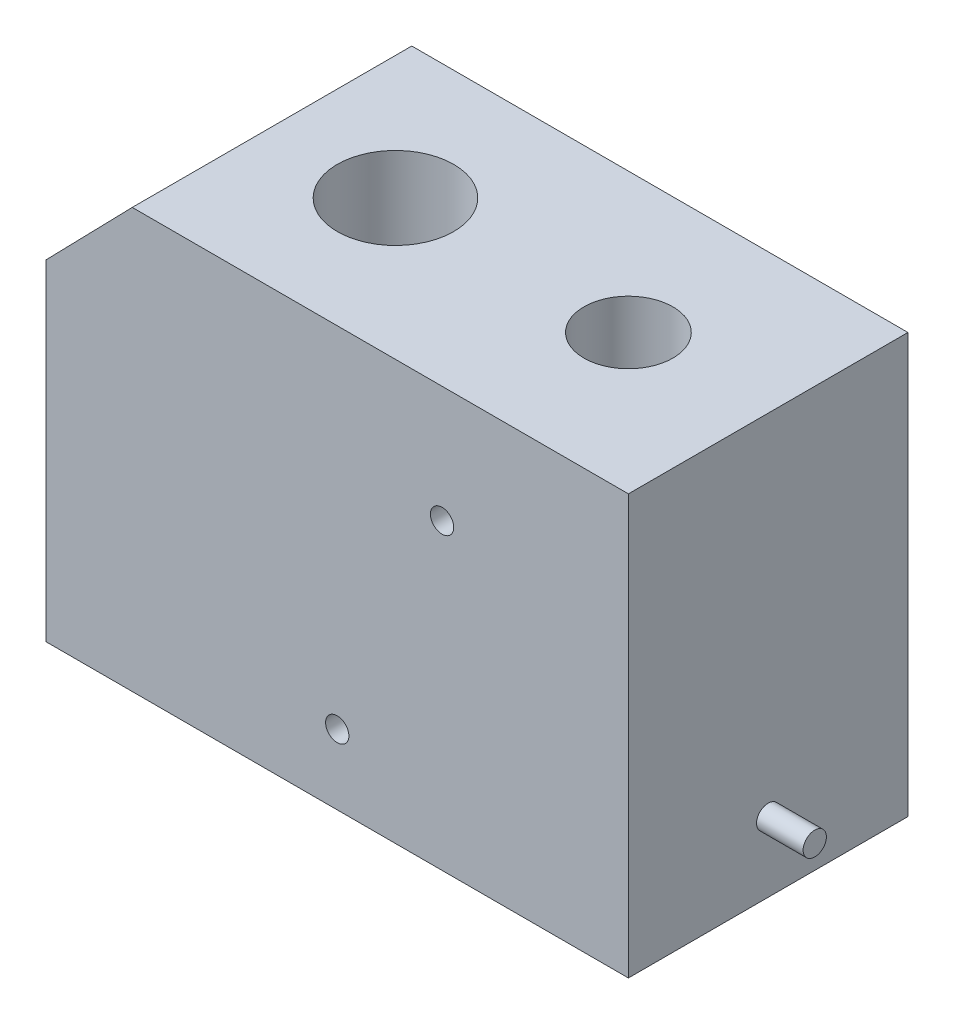
ISO-10303-21;
HEADER;
FILE_DESCRIPTION(('STEP AP214'),'2;1');
FILE_NAME('part.step','',(''),(''),'','','');
FILE_SCHEMA(('AUTOMOTIVE_DESIGN { 1 0 10303 214 1 1 1 1 }'));
ENDSEC;
DATA;
#1=APPLICATION_CONTEXT('core data for automotive mechanical design processes');
#2=APPLICATION_PROTOCOL_DEFINITION('international standard','automotive_design',2000,#1);
#3=PRODUCT_CONTEXT('',#1,'mechanical');
#4=PRODUCT('Part','Part','',(#3));
#5=PRODUCT_RELATED_PRODUCT_CATEGORY('part','',(#4));
#6=PRODUCT_DEFINITION_FORMATION('','',#4);
#7=PRODUCT_DEFINITION_CONTEXT('part definition',#1,'design');
#8=PRODUCT_DEFINITION('design','',#6,#7);
#9=PRODUCT_DEFINITION_SHAPE('','',#8);
#10=(LENGTH_UNIT() NAMED_UNIT(*) SI_UNIT(.MILLI.,.METRE.));
#11=(NAMED_UNIT(*) PLANE_ANGLE_UNIT() SI_UNIT($,.RADIAN.));
#12=(NAMED_UNIT(*) SI_UNIT($,.STERADIAN.) SOLID_ANGLE_UNIT());
#13=UNCERTAINTY_MEASURE_WITH_UNIT(LENGTH_MEASURE(1.E-05),#10,'distance_accuracy_value','');
#14=(GEOMETRIC_REPRESENTATION_CONTEXT(3) GLOBAL_UNCERTAINTY_ASSIGNED_CONTEXT((#13)) GLOBAL_UNIT_ASSIGNED_CONTEXT((#10,
#11,#12)) REPRESENTATION_CONTEXT('',''));
#15=CARTESIAN_POINT('',(0.,0.,0.));
#16=DIRECTION('',(0.,0.,1.));
#17=DIRECTION('',(1.,0.,0.));
#18=AXIS2_PLACEMENT_3D('',#15,#16,#17);
#19=CARTESIAN_POINT('',(0.,0.,0.));
#20=DIRECTION('',(0.,0.,-1.));
#21=DIRECTION('',(-1.,0.,0.));
#22=AXIS2_PLACEMENT_3D('',#19,#20,#21);
#23=PLANE('',#22);
#24=CARTESIAN_POINT('',(55.,-58.,0.));
#25=DIRECTION('',(0.,0.,-1.));
#26=DIRECTION('',(-1.,0.,0.));
#27=AXIS2_PLACEMENT_3D('',#24,#25,#26);
#28=CIRCLE('',#27,5.);
#29=CARTESIAN_POINT('',(50.,-58.,0.));
#30=VERTEX_POINT('',#29);
#31=EDGE_CURVE('E122',#30,#30,#28,.T.);
#32=ORIENTED_EDGE('',*,*,#31,.F.);
#33=EDGE_LOOP('',(#32));
#34=FACE_BOUND('',#33,.T.);
#35=DIRECTION('',(0.,-1.,0.));
#36=VECTOR('',#35,1.);
#37=CARTESIAN_POINT('',(-125.,-90.,0.));
#38=LINE('',#37,#36);
#39=CARTESIAN_POINT('',(-125.,52.,0.));
#40=VERTEX_POINT('',#39);
#41=CARTESIAN_POINT('',(-125.,-90.,0.));
#42=VERTEX_POINT('',#41);
#43=EDGE_CURVE('E163',#40,#42,#38,.T.);
#44=ORIENTED_EDGE('',*,*,#43,.F.);
#45=DIRECTION('',(0.697616683154663,0.716471188104788,0.));
#46=VECTOR('',#45,1.);
#47=CARTESIAN_POINT('',(-88.,90.,0.));
#48=LINE('',#47,#46);
#49=CARTESIAN_POINT('',(-88.,90.,0.));
#50=VERTEX_POINT('',#49);
#51=EDGE_CURVE('E143',#40,#50,#48,.T.);
#52=ORIENTED_EDGE('',*,*,#51,.T.);
#53=DIRECTION('',(-1.,0.,0.));
#54=VECTOR('',#53,1.);
#55=CARTESIAN_POINT('',(-125.,90.,0.));
#56=LINE('',#55,#54);
#57=CARTESIAN_POINT('',(125.,90.,0.));
#58=VERTEX_POINT('',#57);
#59=EDGE_CURVE('E160',#58,#50,#56,.T.);
#60=ORIENTED_EDGE('',*,*,#59,.F.);
#61=DIRECTION('',(0.,1.,0.));
#62=VECTOR('',#61,1.);
#63=CARTESIAN_POINT('',(125.,-90.,0.));
#64=LINE('',#63,#62);
#65=CARTESIAN_POINT('',(125.,-90.,0.));
#66=VERTEX_POINT('',#65);
#67=EDGE_CURVE('E150',#66,#58,#64,.T.);
#68=ORIENTED_EDGE('',*,*,#67,.F.);
#69=DIRECTION('',(1.,0.,0.));
#70=VECTOR('',#69,1.);
#71=CARTESIAN_POINT('',(-125.,-90.,0.));
#72=LINE('',#71,#70);
#73=EDGE_CURVE('E81',#42,#66,#72,.T.);
#74=ORIENTED_EDGE('',*,*,#73,.F.);
#75=EDGE_LOOP('',(#44,#52,#60,#68,#74));
#76=FACE_BOUND('',#75,.T.);
#77=ADVANCED_FACE('F40',(#34,#76),#23,.T.);
#78=CARTESIAN_POINT('',(125.,-90.,120.));
#79=DIRECTION('',(-1.,0.,0.));
#80=DIRECTION('',(0.,0.,1.));
#81=AXIS2_PLACEMENT_3D('',#78,#79,#80);
#82=PLANE('',#81);
#83=CARTESIAN_POINT('',(125.,-60.,60.));
#84=DIRECTION('',(-1.,0.,0.));
#85=DIRECTION('',(0.,0.,1.));
#86=AXIS2_PLACEMENT_3D('',#83,#84,#85);
#87=CIRCLE('',#86,5.);
#88=CARTESIAN_POINT('',(125.,-60.,65.));
#89=VERTEX_POINT('',#88);
#90=EDGE_CURVE('E11',#89,#89,#87,.F.);
#91=ORIENTED_EDGE('',*,*,#90,.F.);
#92=EDGE_LOOP('',(#91));
#93=FACE_BOUND('',#92,.T.);
#94=ORIENTED_EDGE('',*,*,#67,.T.);
#95=DIRECTION('',(0.,0.,-1.));
#96=VECTOR('',#95,1.);
#97=CARTESIAN_POINT('',(125.,90.,120.));
#98=LINE('',#97,#96);
#99=CARTESIAN_POINT('',(125.,90.,120.));
#100=VERTEX_POINT('',#99);
#101=EDGE_CURVE('E48',#100,#58,#98,.T.);
#102=ORIENTED_EDGE('',*,*,#101,.F.);
#103=DIRECTION('',(0.,1.,0.));
#104=VECTOR('',#103,1.);
#105=CARTESIAN_POINT('',(125.,-90.,120.));
#106=LINE('',#105,#104);
#107=CARTESIAN_POINT('',(125.,-90.,120.));
#108=VERTEX_POINT('',#107);
#109=EDGE_CURVE('E151',#108,#100,#106,.T.);
#110=ORIENTED_EDGE('',*,*,#109,.F.);
#111=DIRECTION('',(0.,0.,-1.));
#112=VECTOR('',#111,1.);
#113=CARTESIAN_POINT('',(125.,-90.,120.));
#114=LINE('',#113,#112);
#115=EDGE_CURVE('E157',#108,#66,#114,.T.);
#116=ORIENTED_EDGE('',*,*,#115,.T.);
#117=EDGE_LOOP('',(#94,#102,#110,#116));
#118=FACE_BOUND('',#117,.T.);
#119=ADVANCED_FACE('F42',(#93,#118),#82,.F.);
#120=CARTESIAN_POINT('',(-125.,90.,120.));
#121=DIRECTION('',(0.,-1.,0.));
#122=DIRECTION('',(0.,0.,-1.));
#123=AXIS2_PLACEMENT_3D('',#120,#121,#122);
#124=PLANE('',#123);
#125=CARTESIAN_POINT('',(65.,90.,60.));
#126=DIRECTION('',(0.,1.,0.));
#127=DIRECTION('',(0.,0.,1.));
#128=AXIS2_PLACEMENT_3D('',#125,#126,#127);
#129=CIRCLE('',#128,19.0948250279783);
#130=CARTESIAN_POINT('',(65.,90.,79.0948250279783));
#131=VERTEX_POINT('',#130);
#132=EDGE_CURVE('E214',#131,#131,#129,.T.);
#133=ORIENTED_EDGE('',*,*,#132,.F.);
#134=EDGE_LOOP('',(#133));
#135=FACE_BOUND('',#134,.T.);
#136=CARTESIAN_POINT('',(-35.,90.,60.));
#137=DIRECTION('',(0.,-1.,0.));
#138=DIRECTION('',(0.,0.,-1.));
#139=AXIS2_PLACEMENT_3D('',#136,#137,#138);
#140=CIRCLE('',#139,25.);
#141=CARTESIAN_POINT('',(-35.,90.,35.));
#142=VERTEX_POINT('',#141);
#143=EDGE_CURVE('E119',#142,#142,#140,.T.);
#144=ORIENTED_EDGE('',*,*,#143,.T.);
#145=EDGE_LOOP('',(#144));
#146=FACE_BOUND('',#145,.T.);
#147=ORIENTED_EDGE('',*,*,#59,.T.);
#148=DIRECTION('',(0.,0.,-1.));
#149=VECTOR('',#148,1.);
#150=CARTESIAN_POINT('',(-88.,90.,683.256881370414));
#151=LINE('',#150,#149);
#152=CARTESIAN_POINT('',(-88.,90.,120.));
#153=VERTEX_POINT('',#152);
#154=EDGE_CURVE('E55',#153,#50,#151,.T.);
#155=ORIENTED_EDGE('',*,*,#154,.F.);
#156=DIRECTION('',(-1.,0.,0.));
#157=VECTOR('',#156,1.);
#158=CARTESIAN_POINT('',(-125.,90.,120.));
#159=LINE('',#158,#157);
#160=EDGE_CURVE('E87',#100,#153,#159,.T.);
#161=ORIENTED_EDGE('',*,*,#160,.F.);
#162=ORIENTED_EDGE('',*,*,#101,.T.);
#163=EDGE_LOOP('',(#147,#155,#161,#162));
#164=FACE_BOUND('',#163,.T.);
#165=ADVANCED_FACE('F169',(#135,#146,#164),#124,.F.);
#166=CARTESIAN_POINT('',(-125.,-90.,120.));
#167=DIRECTION('',(1.,0.,0.));
#168=DIRECTION('',(0.,0.,-1.));
#169=AXIS2_PLACEMENT_3D('',#166,#167,#168);
#170=PLANE('',#169);
#171=CARTESIAN_POINT('',(-125.,-43.,98.));
#172=DIRECTION('',(-1.,0.,0.));
#173=DIRECTION('',(0.,0.,1.));
#174=AXIS2_PLACEMENT_3D('',#171,#172,#173);
#175=CIRCLE('',#174,4.99999999999999);
#176=CARTESIAN_POINT('',(-125.,-43.,103.));
#177=VERTEX_POINT('',#176);
#178=EDGE_CURVE('E109',#177,#177,#175,.T.);
#179=ORIENTED_EDGE('',*,*,#178,.F.);
#180=EDGE_LOOP('',(#179));
#181=FACE_BOUND('',#180,.T.);
#182=DIRECTION('',(0.,-1.,0.));
#183=VECTOR('',#182,1.);
#184=CARTESIAN_POINT('',(-125.,-90.,120.));
#185=LINE('',#184,#183);
#186=CARTESIAN_POINT('',(-125.,52.,120.));
#187=VERTEX_POINT('',#186);
#188=CARTESIAN_POINT('',(-125.,-90.,120.));
#189=VERTEX_POINT('',#188);
#190=EDGE_CURVE('E154',#187,#189,#185,.T.);
#191=ORIENTED_EDGE('',*,*,#190,.F.);
#192=DIRECTION('',(0.,0.,-1.));
#193=VECTOR('',#192,1.);
#194=CARTESIAN_POINT('',(-125.,52.,683.256881370414));
#195=LINE('',#194,#193);
#196=EDGE_CURVE('E145',#187,#40,#195,.T.);
#197=ORIENTED_EDGE('',*,*,#196,.T.);
#198=ORIENTED_EDGE('',*,*,#43,.T.);
#199=DIRECTION('',(0.,0.,-1.));
#200=VECTOR('',#199,1.);
#201=CARTESIAN_POINT('',(-125.,-90.,120.));
#202=LINE('',#201,#200);
#203=EDGE_CURVE('E167',#189,#42,#202,.T.);
#204=ORIENTED_EDGE('',*,*,#203,.F.);
#205=EDGE_LOOP('',(#191,#197,#198,#204));
#206=FACE_BOUND('',#205,.T.);
#207=ADVANCED_FACE('F179',(#181,#206),#170,.F.);
#208=CARTESIAN_POINT('',(-125.,-90.,120.));
#209=DIRECTION('',(0.,1.,0.));
#210=DIRECTION('',(0.,0.,1.));
#211=AXIS2_PLACEMENT_3D('',#208,#209,#210);
#212=PLANE('',#211);
#213=CARTESIAN_POINT('',(-35.,-90.,60.));
#214=DIRECTION('',(0.,-1.,0.));
#215=DIRECTION('',(0.,0.,-1.));
#216=AXIS2_PLACEMENT_3D('',#213,#214,#215);
#217=CIRCLE('',#216,25.);
#218=CARTESIAN_POINT('',(-35.,-90.,35.));
#219=VERTEX_POINT('',#218);
#220=EDGE_CURVE('E112',#219,#219,#217,.T.);
#221=ORIENTED_EDGE('',*,*,#220,.F.);
#222=EDGE_LOOP('',(#221));
#223=FACE_BOUND('',#222,.T.);
#224=ORIENTED_EDGE('',*,*,#73,.T.);
#225=ORIENTED_EDGE('',*,*,#115,.F.);
#226=DIRECTION('',(1.,0.,0.));
#227=VECTOR('',#226,1.);
#228=CARTESIAN_POINT('',(-125.,-90.,120.));
#229=LINE('',#228,#227);
#230=EDGE_CURVE('E64',#189,#108,#229,.T.);
#231=ORIENTED_EDGE('',*,*,#230,.F.);
#232=ORIENTED_EDGE('',*,*,#203,.T.);
#233=EDGE_LOOP('',(#224,#225,#231,#232));
#234=FACE_BOUND('',#233,.T.);
#235=ADVANCED_FACE('F183',(#223,#234),#212,.F.);
#236=CARTESIAN_POINT('',(0.,0.,120.));
#237=DIRECTION('',(0.,0.,-1.));
#238=DIRECTION('',(-1.,0.,0.));
#239=AXIS2_PLACEMENT_3D('',#236,#237,#238);
#240=PLANE('',#239);
#241=CARTESIAN_POINT('',(0.,-60.,120.));
#242=DIRECTION('',(0.,0.,1.));
#243=DIRECTION('',(1.,0.,0.));
#244=AXIS2_PLACEMENT_3D('',#241,#242,#243);
#245=CIRCLE('',#244,5.);
#246=CARTESIAN_POINT('',(5.00000000000003,-60.,120.));
#247=VERTEX_POINT('',#246);
#248=EDGE_CURVE('E128',#247,#247,#245,.T.);
#249=ORIENTED_EDGE('',*,*,#248,.F.);
#250=EDGE_LOOP('',(#249));
#251=FACE_BOUND('',#250,.T.);
#252=CARTESIAN_POINT('',(45.,40.,120.));
#253=DIRECTION('',(0.,0.,1.));
#254=DIRECTION('',(1.,0.,0.));
#255=AXIS2_PLACEMENT_3D('',#252,#253,#254);
#256=CIRCLE('',#255,5.);
#257=CARTESIAN_POINT('',(50.,40.,120.));
#258=VERTEX_POINT('',#257);
#259=EDGE_CURVE('E134',#258,#258,#256,.T.);
#260=ORIENTED_EDGE('',*,*,#259,.F.);
#261=EDGE_LOOP('',(#260));
#262=FACE_BOUND('',#261,.T.);
#263=ORIENTED_EDGE('',*,*,#160,.T.);
#264=DIRECTION('',(0.697616683154663,0.716471188104788,0.));
#265=VECTOR('',#264,1.);
#266=CARTESIAN_POINT('',(-88.,90.,120.));
#267=LINE('',#266,#265);
#268=EDGE_CURVE('E140',#187,#153,#267,.T.);
#269=ORIENTED_EDGE('',*,*,#268,.F.);
#270=ORIENTED_EDGE('',*,*,#190,.T.);
#271=ORIENTED_EDGE('',*,*,#230,.T.);
#272=ORIENTED_EDGE('',*,*,#109,.T.);
#273=EDGE_LOOP('',(#263,#269,#270,#271,#272));
#274=FACE_BOUND('',#273,.T.);
#275=ADVANCED_FACE('F181',(#251,#262,#274),#240,.F.);
#276=CARTESIAN_POINT('',(-88.,90.,683.256881370414));
#277=DIRECTION('',(0.716471188104788,-0.697616683154663,0.));
#278=DIRECTION('',(0.697616683154663,0.716471188104788,0.));
#279=AXIS2_PLACEMENT_3D('',#276,#277,#278);
#280=PLANE('',#279);
#281=ORIENTED_EDGE('',*,*,#268,.T.);
#282=ORIENTED_EDGE('',*,*,#154,.T.);
#283=ORIENTED_EDGE('',*,*,#51,.F.);
#284=ORIENTED_EDGE('',*,*,#196,.F.);
#285=EDGE_LOOP('',(#281,#282,#283,#284));
#286=FACE_BOUND('',#285,.T.);
#287=ADVANCED_FACE('F175',(#286),#280,.F.);
#288=CARTESIAN_POINT('',(45.,40.,100.));
#289=DIRECTION('',(0.,0.,1.));
#290=DIRECTION('',(1.,0.,0.));
#291=AXIS2_PLACEMENT_3D('',#288,#289,#290);
#292=CYLINDRICAL_SURFACE('',#291,5.);
#293=CARTESIAN_POINT('',(45.,40.,100.));
#294=DIRECTION('',(0.,0.,1.));
#295=DIRECTION('',(1.,0.,0.));
#296=AXIS2_PLACEMENT_3D('',#293,#294,#295);
#297=CIRCLE('',#296,5.);
#298=CARTESIAN_POINT('',(50.,40.,100.));
#299=VERTEX_POINT('',#298);
#300=EDGE_CURVE('E137',#299,#299,#297,.T.);
#301=ORIENTED_EDGE('',*,*,#300,.F.);
#302=EDGE_LOOP('',(#301));
#303=FACE_BOUND('',#302,.T.);
#304=ORIENTED_EDGE('',*,*,#259,.T.);
#305=EDGE_LOOP('',(#304));
#306=FACE_BOUND('',#305,.T.);
#307=ADVANCED_FACE('F190',(#303,#306),#292,.F.);
#308=CARTESIAN_POINT('',(45.,40.,100.));
#309=DIRECTION('',(0.,0.,1.));
#310=DIRECTION('',(1.,0.,0.));
#311=AXIS2_PLACEMENT_3D('',#308,#309,#310);
#312=PLANE('',#311);
#313=ORIENTED_EDGE('',*,*,#300,.T.);
#314=EDGE_LOOP('',(#313));
#315=FACE_BOUND('',#314,.T.);
#316=ADVANCED_FACE('F245',(#315),#312,.T.);
#317=CARTESIAN_POINT('',(0.,-60.,100.));
#318=DIRECTION('',(0.,0.,1.));
#319=DIRECTION('',(1.,0.,0.));
#320=AXIS2_PLACEMENT_3D('',#317,#318,#319);
#321=CYLINDRICAL_SURFACE('',#320,5.);
#322=CARTESIAN_POINT('',(0.,-60.,100.));
#323=DIRECTION('',(0.,0.,1.));
#324=DIRECTION('',(1.,0.,0.));
#325=AXIS2_PLACEMENT_3D('',#322,#323,#324);
#326=CIRCLE('',#325,5.);
#327=CARTESIAN_POINT('',(5.00000000000003,-60.,100.));
#328=VERTEX_POINT('',#327);
#329=EDGE_CURVE('E131',#328,#328,#326,.T.);
#330=ORIENTED_EDGE('',*,*,#329,.F.);
#331=EDGE_LOOP('',(#330));
#332=FACE_BOUND('',#331,.T.);
#333=ORIENTED_EDGE('',*,*,#248,.T.);
#334=EDGE_LOOP('',(#333));
#335=FACE_BOUND('',#334,.T.);
#336=ADVANCED_FACE('F241',(#332,#335),#321,.F.);
#337=CARTESIAN_POINT('',(0.,-60.,100.));
#338=DIRECTION('',(0.,0.,1.));
#339=DIRECTION('',(1.,0.,0.));
#340=AXIS2_PLACEMENT_3D('',#337,#338,#339);
#341=PLANE('',#340);
#342=ORIENTED_EDGE('',*,*,#329,.T.);
#343=EDGE_LOOP('',(#342));
#344=FACE_BOUND('',#343,.T.);
#345=ADVANCED_FACE('F237',(#344),#341,.T.);
#346=CARTESIAN_POINT('',(55.,-58.,20.));
#347=DIRECTION('',(0.,0.,-1.));
#348=DIRECTION('',(-1.,0.,0.));
#349=AXIS2_PLACEMENT_3D('',#346,#347,#348);
#350=CYLINDRICAL_SURFACE('',#349,5.);
#351=CARTESIAN_POINT('',(55.,-58.,20.));
#352=DIRECTION('',(0.,0.,-1.));
#353=DIRECTION('',(-1.,0.,0.));
#354=AXIS2_PLACEMENT_3D('',#351,#352,#353);
#355=CIRCLE('',#354,5.);
#356=CARTESIAN_POINT('',(50.,-58.,20.));
#357=VERTEX_POINT('',#356);
#358=EDGE_CURVE('E125',#357,#357,#355,.T.);
#359=ORIENTED_EDGE('',*,*,#358,.F.);
#360=EDGE_LOOP('',(#359));
#361=FACE_BOUND('',#360,.T.);
#362=ORIENTED_EDGE('',*,*,#31,.T.);
#363=EDGE_LOOP('',(#362));
#364=FACE_BOUND('',#363,.T.);
#365=ADVANCED_FACE('F230',(#361,#364),#350,.F.);
#366=CARTESIAN_POINT('',(55.,-58.,20.));
#367=DIRECTION('',(0.,0.,-1.));
#368=DIRECTION('',(-1.,0.,0.));
#369=AXIS2_PLACEMENT_3D('',#366,#367,#368);
#370=PLANE('',#369);
#371=ORIENTED_EDGE('',*,*,#358,.T.);
#372=EDGE_LOOP('',(#371));
#373=FACE_BOUND('',#372,.T.);
#374=ADVANCED_FACE('F221',(#373),#370,.T.);
#375=CARTESIAN_POINT('',(-35.,90.,60.));
#376=DIRECTION('',(0.,-1.,0.));
#377=DIRECTION('',(0.,0.,-1.));
#378=AXIS2_PLACEMENT_3D('',#375,#376,#377);
#379=CYLINDRICAL_SURFACE('',#378,25.);
#380=CARTESIAN_POINT('',(-35.,90.,35.));
#381=CARTESIAN_POINT('',(-35.,88.125,35.));
#382=CARTESIAN_POINT('',(-35.,86.25,35.));
#383=CARTESIAN_POINT('',(-35.,82.5,35.));
#384=CARTESIAN_POINT('',(-35.,80.625,35.));
#385=CARTESIAN_POINT('',(-35.,76.875,35.));
#386=CARTESIAN_POINT('',(-35.,75.,35.));
#387=CARTESIAN_POINT('',(-35.,71.25,35.));
#388=CARTESIAN_POINT('',(-35.,69.375,35.));
#389=CARTESIAN_POINT('',(-35.,65.625,35.));
#390=CARTESIAN_POINT('',(-35.,63.75,35.));
#391=CARTESIAN_POINT('',(-35.,60.,35.));
#392=CARTESIAN_POINT('',(-35.,58.125,35.));
#393=CARTESIAN_POINT('',(-35.,54.375,35.));
#394=CARTESIAN_POINT('',(-35.,52.5,35.));
#395=CARTESIAN_POINT('',(-35.,48.75,35.));
#396=CARTESIAN_POINT('',(-35.,46.875,35.));
#397=CARTESIAN_POINT('',(-35.,43.125,35.));
#398=CARTESIAN_POINT('',(-35.,41.25,35.));
#399=CARTESIAN_POINT('',(-35.,37.5,35.));
#400=CARTESIAN_POINT('',(-35.,35.625,35.));
#401=CARTESIAN_POINT('',(-35.,31.875,35.));
#402=CARTESIAN_POINT('',(-35.,30.,35.));
#403=CARTESIAN_POINT('',(-35.,26.25,35.));
#404=CARTESIAN_POINT('',(-35.,24.375,35.));
#405=CARTESIAN_POINT('',(-35.,20.625,35.));
#406=CARTESIAN_POINT('',(-35.,18.75,35.));
#407=CARTESIAN_POINT('',(-35.,15.,35.));
#408=CARTESIAN_POINT('',(-35.,13.125,35.));
#409=CARTESIAN_POINT('',(-35.,9.37500000000001,35.));
#410=CARTESIAN_POINT('',(-35.,7.50000000000002,35.));
#411=CARTESIAN_POINT('',(-35.,3.75000000000002,35.));
#412=CARTESIAN_POINT('',(-35.,1.87500000000002,35.));
#413=CARTESIAN_POINT('',(-35.,-1.87499999999999,35.));
#414=CARTESIAN_POINT('',(-35.,-3.74999999999999,35.));
#415=CARTESIAN_POINT('',(-35.,-7.49999999999999,35.));
#416=CARTESIAN_POINT('',(-35.,-9.37499999999999,35.));
#417=CARTESIAN_POINT('',(-35.,-13.125,35.));
#418=CARTESIAN_POINT('',(-35.,-15.,35.));
#419=CARTESIAN_POINT('',(-35.,-18.75,35.));
#420=CARTESIAN_POINT('',(-35.,-20.625,35.));
#421=CARTESIAN_POINT('',(-35.,-24.375,35.));
#422=CARTESIAN_POINT('',(-35.,-26.25,35.));
#423=CARTESIAN_POINT('',(-35.,-30.,35.));
#424=CARTESIAN_POINT('',(-35.,-31.875,35.));
#425=CARTESIAN_POINT('',(-35.,-35.625,35.));
#426=CARTESIAN_POINT('',(-35.,-37.5,35.));
#427=CARTESIAN_POINT('',(-35.,-41.25,35.));
#428=CARTESIAN_POINT('',(-35.,-43.125,35.));
#429=CARTESIAN_POINT('',(-35.,-46.875,35.));
#430=CARTESIAN_POINT('',(-35.,-48.75,35.));
#431=CARTESIAN_POINT('',(-35.,-52.5,35.));
#432=CARTESIAN_POINT('',(-35.,-54.375,35.));
#433=CARTESIAN_POINT('',(-35.,-58.125,35.));
#434=CARTESIAN_POINT('',(-35.,-60.,35.));
#435=CARTESIAN_POINT('',(-35.,-63.75,35.));
#436=CARTESIAN_POINT('',(-35.,-65.625,35.));
#437=CARTESIAN_POINT('',(-35.,-69.375,35.));
#438=CARTESIAN_POINT('',(-35.,-71.25,35.));
#439=CARTESIAN_POINT('',(-35.,-75.,35.));
#440=CARTESIAN_POINT('',(-35.,-76.875,35.));
#441=CARTESIAN_POINT('',(-35.,-80.625,35.));
#442=CARTESIAN_POINT('',(-35.,-82.5,35.));
#443=CARTESIAN_POINT('',(-35.,-86.25,35.));
#444=CARTESIAN_POINT('',(-35.,-88.125,35.));
#445=CARTESIAN_POINT('',(-35.,-90.,35.));
#446=B_SPLINE_CURVE_WITH_KNOTS('',3,(#380,#381,#382,#383,#384,#385,#386,#387,#388,#389,#390,
#391,#392,#393,#394,#395,#396,#397,#398,#399,#400,#401,#402,#403,#404,#405,#406,#407,#408,#409,
#410,#411,#412,#413,#414,#415,#416,#417,#418,#419,#420,#421,#422,#423,#424,#425,#426,#427,#428,
#429,#430,#431,#432,#433,#434,#435,#436,#437,#438,#439,#440,#441,#442,#443,#444,#445),
.UNSPECIFIED.,.F.,.F.,(4,2,2,2,2,2,2,2,2,2,2,2,2,2,2,2,2,2,2,2,2,2,2,2,2,2,2,2,2,2,2,2,4),(0.,
5.62499999999999,11.25,16.875,22.5,28.125,33.75,39.375,45.,50.625,56.25,61.875,67.5,73.125,
78.75,84.375,90.,95.625,101.25,106.875,112.5,118.125,123.75,129.375,135.,140.625,146.25,151.875,
157.5,163.125,168.75,174.375,180.),.UNSPECIFIED.);
#447=EDGE_CURVE('BSEAM217',#142,#219,#446,.T.);
#448=ORIENTED_EDGE('',*,*,#143,.F.);
#449=ORIENTED_EDGE('',*,*,#220,.T.);
#450=ORIENTED_EDGE('',*,*,#447,.T.);
#451=ORIENTED_EDGE('',*,*,#447,.F.);
#452=EDGE_LOOP('',(#448,#450,#449,#451));
#453=FACE_BOUND('',#452,.T.);
#454=ADVANCED_FACE('F217',(#453),#379,.F.);
#455=CARTESIAN_POINT('',(145.,-60.,60.));
#456=DIRECTION('',(-1.,0.,0.));
#457=DIRECTION('',(0.,0.,1.));
#458=AXIS2_PLACEMENT_3D('',#455,#456,#457);
#459=CYLINDRICAL_SURFACE('',#458,5.);
#460=CARTESIAN_POINT('',(145.,-60.,60.));
#461=DIRECTION('',(1.,0.,0.));
#462=DIRECTION('',(0.,0.,-1.));
#463=AXIS2_PLACEMENT_3D('',#460,#461,#462);
#464=CIRCLE('',#463,5.);
#465=CARTESIAN_POINT('',(145.,-60.,55.));
#466=VERTEX_POINT('',#465);
#467=EDGE_CURVE('E108',#466,#466,#464,.T.);
#468=ORIENTED_EDGE('',*,*,#467,.F.);
#469=EDGE_LOOP('',(#468));
#470=FACE_BOUND('',#469,.T.);
#471=ORIENTED_EDGE('',*,*,#90,.T.);
#472=EDGE_LOOP('',(#471));
#473=FACE_BOUND('',#472,.T.);
#474=ADVANCED_FACE('F220',(#470,#473),#459,.T.);
#475=CARTESIAN_POINT('',(145.,-60.,60.));
#476=DIRECTION('',(1.,0.,0.));
#477=DIRECTION('',(0.,0.,-1.));
#478=AXIS2_PLACEMENT_3D('',#475,#476,#477);
#479=PLANE('',#478);
#480=ORIENTED_EDGE('',*,*,#467,.T.);
#481=EDGE_LOOP('',(#480));
#482=FACE_BOUND('',#481,.T.);
#483=ADVANCED_FACE('F102',(#482),#479,.T.);
#484=CARTESIAN_POINT('',(-105.,-43.,98.));
#485=DIRECTION('',(-1.,0.,0.));
#486=DIRECTION('',(0.,0.,1.));
#487=AXIS2_PLACEMENT_3D('',#484,#485,#486);
#488=CONICAL_SURFACE('',#487,5.,1.02974425867665);
#489=CARTESIAN_POINT('',(-101.995696904862,-43.,98.));
#490=VERTEX_POINT('',#489);
#491=VERTEX_LOOP('',#490);
#492=FACE_BOUND('',#491,.T.);
#493=CARTESIAN_POINT('',(-105.,-43.,98.));
#494=DIRECTION('',(-1.,0.,0.));
#495=DIRECTION('',(0.,0.,1.));
#496=AXIS2_PLACEMENT_3D('',#493,#494,#495);
#497=CIRCLE('',#496,5.);
#498=CARTESIAN_POINT('',(-105.,-43.,103.));
#499=VERTEX_POINT('',#498);
#500=EDGE_CURVE('E106',#499,#499,#497,.T.);
#501=ORIENTED_EDGE('',*,*,#500,.T.);
#502=EDGE_LOOP('',(#501));
#503=FACE_BOUND('',#502,.T.);
#504=ADVANCED_FACE('F98',(#492,#503),#488,.F.);
#505=CARTESIAN_POINT('',(-125.,-43.,98.));
#506=DIRECTION('',(-1.,0.,0.));
#507=DIRECTION('',(0.,0.,1.));
#508=AXIS2_PLACEMENT_3D('',#505,#506,#507);
#509=CYLINDRICAL_SURFACE('',#508,4.99999999999999);
#510=ORIENTED_EDGE('',*,*,#500,.F.);
#511=EDGE_LOOP('',(#510));
#512=FACE_BOUND('',#511,.T.);
#513=ORIENTED_EDGE('',*,*,#178,.T.);
#514=EDGE_LOOP('',(#513));
#515=FACE_BOUND('',#514,.T.);
#516=ADVANCED_FACE('F101',(#512,#515),#509,.F.);
#517=CARTESIAN_POINT('',(65.,40.,60.));
#518=DIRECTION('',(0.,1.,0.));
#519=DIRECTION('',(0.,0.,1.));
#520=AXIS2_PLACEMENT_3D('',#517,#518,#519);
#521=CYLINDRICAL_SURFACE('',#520,19.0948250279783);
#522=CARTESIAN_POINT('',(65.,40.,60.));
#523=DIRECTION('',(0.,1.,0.));
#524=DIRECTION('',(0.,0.,1.));
#525=AXIS2_PLACEMENT_3D('',#522,#523,#524);
#526=CIRCLE('',#525,19.0948250279783);
#527=CARTESIAN_POINT('',(65.,40.,79.0948250279783));
#528=VERTEX_POINT('',#527);
#529=EDGE_CURVE('E115',#528,#528,#526,.T.);
#530=ORIENTED_EDGE('',*,*,#529,.F.);
#531=EDGE_LOOP('',(#530));
#532=FACE_BOUND('',#531,.T.);
#533=ORIENTED_EDGE('',*,*,#132,.T.);
#534=EDGE_LOOP('',(#533));
#535=FACE_BOUND('',#534,.T.);
#536=ADVANCED_FACE('F315',(#532,#535),#521,.F.);
#537=CARTESIAN_POINT('',(65.,40.,60.));
#538=DIRECTION('',(0.,1.,0.));
#539=DIRECTION('',(0.,0.,1.));
#540=AXIS2_PLACEMENT_3D('',#537,#538,#539);
#541=PLANE('',#540);
#542=ORIENTED_EDGE('',*,*,#529,.T.);
#543=EDGE_LOOP('',(#542));
#544=FACE_BOUND('',#543,.T.);
#545=ADVANCED_FACE('F325',(#544),#541,.T.);
#546=CLOSED_SHELL('',(#77,#119,#165,#207,#235,#275,#287,#307,#316,#336,#345,#365,#374,#454,#474,
#483,#504,#516,#536,#545));
#547=MANIFOLD_SOLID_BREP('B2',#546);
#548=ADVANCED_BREP_SHAPE_REPRESENTATION('',(#18,#547),#14);
#549=SHAPE_DEFINITION_REPRESENTATION(#9,#548);
ENDSEC;
END-ISO-10303-21;
